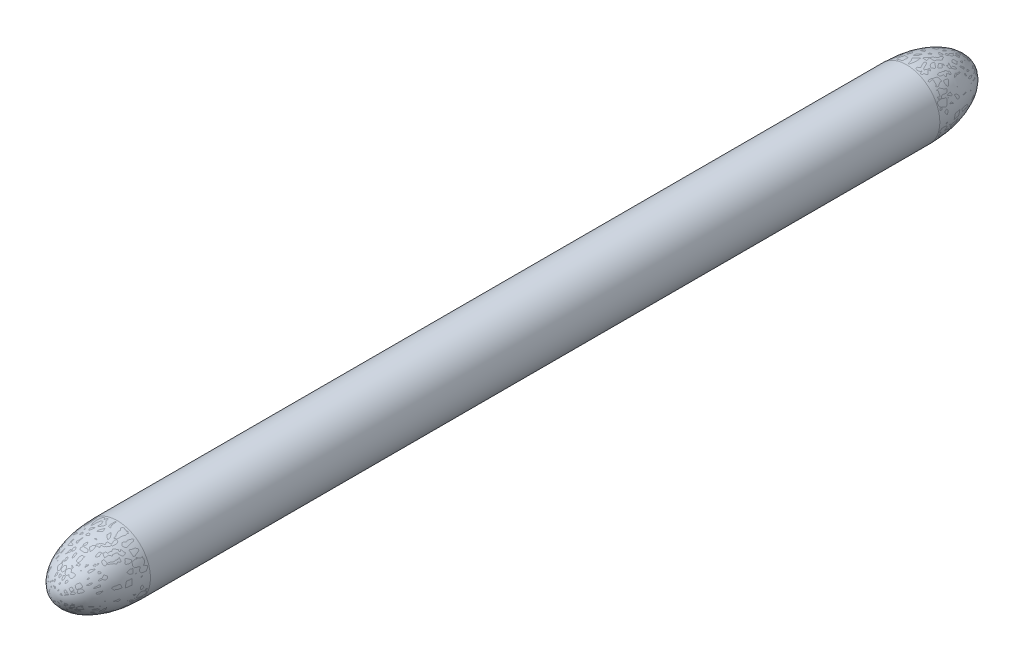
ISO-10303-21;
HEADER;
FILE_DESCRIPTION(('STEP AP214'),'2;1');
FILE_NAME('part.step','',(''),(''),'','','');
FILE_SCHEMA(('AUTOMOTIVE_DESIGN { 1 0 10303 214 1 1 1 1 }'));
ENDSEC;
DATA;
#1=APPLICATION_CONTEXT('core data for automotive mechanical design processes');
#2=APPLICATION_PROTOCOL_DEFINITION('international standard','automotive_design',2000,#1);
#3=PRODUCT_CONTEXT('',#1,'mechanical');
#4=PRODUCT('Part','Part','',(#3));
#5=PRODUCT_RELATED_PRODUCT_CATEGORY('part','',(#4));
#6=PRODUCT_DEFINITION_FORMATION('','',#4);
#7=PRODUCT_DEFINITION_CONTEXT('part definition',#1,'design');
#8=PRODUCT_DEFINITION('design','',#6,#7);
#9=PRODUCT_DEFINITION_SHAPE('','',#8);
#10=(LENGTH_UNIT() NAMED_UNIT(*) SI_UNIT(.MILLI.,.METRE.));
#11=(NAMED_UNIT(*) PLANE_ANGLE_UNIT() SI_UNIT($,.RADIAN.));
#12=(NAMED_UNIT(*) SI_UNIT($,.STERADIAN.) SOLID_ANGLE_UNIT());
#13=UNCERTAINTY_MEASURE_WITH_UNIT(LENGTH_MEASURE(1.E-05),#10,'distance_accuracy_value','');
#14=(GEOMETRIC_REPRESENTATION_CONTEXT(3) GLOBAL_UNCERTAINTY_ASSIGNED_CONTEXT((#13)) GLOBAL_UNIT_ASSIGNED_CONTEXT((#10,
#11,#12)) REPRESENTATION_CONTEXT('',''));
#15=CARTESIAN_POINT('',(0.,0.,0.));
#16=DIRECTION('',(0.,0.,1.));
#17=DIRECTION('',(1.,0.,0.));
#18=AXIS2_PLACEMENT_3D('',#15,#16,#17);
#19=CARTESIAN_POINT('',(0.,0.,25000.));
#20=DIRECTION('',(0.,0.,-1.));
#21=DIRECTION('',(-1.,0.,0.));
#22=AXIS2_PLACEMENT_3D('',#19,#20,#21);
#23=CYLINDRICAL_SURFACE('',#22,1050.);
#24=CARTESIAN_POINT('',(0.,0.,25000.));
#25=DIRECTION('',(0.,0.,1.));
#26=DIRECTION('',(1.,0.,0.));
#27=AXIS2_PLACEMENT_3D('',#24,#25,#26);
#28=CIRCLE('',#27,1050.);
#29=CARTESIAN_POINT('',(1050.,0.,25000.));
#30=VERTEX_POINT('',#29);
#31=EDGE_CURVE('E65',#30,#30,#28,.T.);
#32=ORIENTED_EDGE('',*,*,#31,.F.);
#33=EDGE_LOOP('',(#32));
#34=FACE_BOUND('',#33,.T.);
#35=CARTESIAN_POINT('',(0.,0.,0.));
#36=DIRECTION('',(0.,0.,1.));
#37=DIRECTION('',(1.,0.,0.));
#38=AXIS2_PLACEMENT_3D('',#35,#36,#37);
#39=CIRCLE('',#38,1050.);
#40=CARTESIAN_POINT('',(1050.,0.,0.));
#41=VERTEX_POINT('',#40);
#42=EDGE_CURVE('E67',#41,#41,#39,.T.);
#43=ORIENTED_EDGE('',*,*,#42,.T.);
#44=EDGE_LOOP('',(#43));
#45=FACE_BOUND('',#44,.T.);
#46=ADVANCED_FACE('F36',(#34,#45),#23,.T.);
#47=CARTESIAN_POINT('',(0.,0.,25000.));
#48=DIRECTION('',(0.,1.,0.));
#49=DIRECTION('',(0.,0.,1.));
#50=AXIS2_PLACEMENT_3D('',#47,#48,#49);
#51=ELLIPSE('',#50,2000.,1050.);
#52=TRIMMED_CURVE('',#51,(PARAMETER_VALUE(0.)),(PARAMETER_VALUE(3.14159265358979)),.T.,.PARAMETER.);
#53=CARTESIAN_POINT('',(0.,0.,23000.));
#54=DIRECTION('',(0.,0.,1.));
#55=AXIS1_PLACEMENT('',#53,#54);
#56=SURFACE_OF_REVOLUTION('',#52,#55);
#57=CARTESIAN_POINT('',(0.,0.,27000.));
#58=VERTEX_POINT('',#57);
#59=VERTEX_LOOP('',#58);
#60=FACE_BOUND('',#59,.T.);
#61=ORIENTED_EDGE('',*,*,#31,.T.);
#62=EDGE_LOOP('',(#61));
#63=FACE_BOUND('',#62,.T.);
#64=ADVANCED_FACE('F58',(#60,#63),#56,.F.);
#65=CARTESIAN_POINT('',(0.,0.,0.));
#66=DIRECTION('',(0.,-1.,0.));
#67=DIRECTION('',(0.,0.,-1.));
#68=AXIS2_PLACEMENT_3D('',#65,#66,#67);
#69=ELLIPSE('',#68,2000.,1050.);
#70=TRIMMED_CURVE('',#69,(PARAMETER_VALUE(0.)),(PARAMETER_VALUE(3.14159265358979)),.T.,.PARAMETER.);
#71=CARTESIAN_POINT('',(0.,0.,2000.));
#72=DIRECTION('',(0.,0.,-1.));
#73=AXIS1_PLACEMENT('',#71,#72);
#74=SURFACE_OF_REVOLUTION('',#70,#73);
#75=CARTESIAN_POINT('',(0.,0.,-2000.));
#76=VERTEX_POINT('',#75);
#77=VERTEX_LOOP('',#76);
#78=FACE_BOUND('',#77,.T.);
#79=ORIENTED_EDGE('',*,*,#42,.F.);
#80=EDGE_LOOP('',(#79));
#81=FACE_BOUND('',#80,.T.);
#82=ADVANCED_FACE('F61',(#78,#81),#74,.F.);
#83=CLOSED_SHELL('',(#46,#64,#82));
#84=CARTESIAN_POINT('',(0.,0.,25000.));
#85=DIRECTION('',(0.,0.,-1.));
#86=DIRECTION('',(-1.,0.,0.));
#87=AXIS2_PLACEMENT_3D('',#84,#85,#86);
#88=CYLINDRICAL_SURFACE('',#87,1047.);
#89=CARTESIAN_POINT('',(0.,0.,25000.));
#90=DIRECTION('',(0.,0.,1.));
#91=DIRECTION('',(1.,0.,0.));
#92=AXIS2_PLACEMENT_3D('',#89,#90,#91);
#93=CIRCLE('',#92,1047.);
#94=CARTESIAN_POINT('',(1047.,0.,25000.));
#95=VERTEX_POINT('',#94);
#96=EDGE_CURVE('E11',#95,#95,#93,.T.);
#97=ORIENTED_EDGE('',*,*,#96,.T.);
#98=EDGE_LOOP('',(#97));
#99=FACE_BOUND('',#98,.T.);
#100=CARTESIAN_POINT('',(0.,0.,0.));
#101=DIRECTION('',(0.,0.,-1.));
#102=DIRECTION('',(-1.,0.,0.));
#103=AXIS2_PLACEMENT_3D('',#100,#101,#102);
#104=CIRCLE('',#103,1047.);
#105=CARTESIAN_POINT('',(-1047.,0.,0.));
#106=VERTEX_POINT('',#105);
#107=EDGE_CURVE('E41',#106,#106,#104,.F.);
#108=ORIENTED_EDGE('',*,*,#107,.F.);
#109=EDGE_LOOP('',(#108));
#110=FACE_BOUND('',#109,.T.);
#111=ADVANCED_FACE('F80',(#99,#110),#88,.F.);
#112=CARTESIAN_POINT('',(0.,0.,25000.));
#113=DIRECTION('',(0.,1.,0.));
#114=DIRECTION('',(0.,0.,1.));
#115=AXIS2_PLACEMENT_3D('',#112,#113,#114);
#116=ELLIPSE('',#115,2000.,1050.);
#117=TRIMMED_CURVE('',#116,(PARAMETER_VALUE(0.)),(PARAMETER_VALUE(3.14159265358979)),.T.,.PARAMETER.);
#118=CARTESIAN_POINT('',(0.,0.,23000.));
#119=DIRECTION('',(0.,0.,1.));
#120=AXIS1_PLACEMENT('',#118,#119);
#121=SURFACE_OF_REVOLUTION('',#117,#120);
#122=OFFSET_SURFACE('',#121,3.,.F.);
#123=CARTESIAN_POINT('',(0.,0.,26997.));
#124=VERTEX_POINT('',#123);
#125=VERTEX_LOOP('',#124);
#126=FACE_BOUND('',#125,.T.);
#127=ORIENTED_EDGE('',*,*,#96,.F.);
#128=EDGE_LOOP('',(#127));
#129=FACE_BOUND('',#128,.T.);
#130=ADVANCED_FACE('F88',(#126,#129),#122,.T.);
#131=CARTESIAN_POINT('',(0.,0.,0.));
#132=DIRECTION('',(0.,-1.,0.));
#133=DIRECTION('',(0.,0.,-1.));
#134=AXIS2_PLACEMENT_3D('',#131,#132,#133);
#135=ELLIPSE('',#134,2000.,1050.);
#136=TRIMMED_CURVE('',#135,(PARAMETER_VALUE(0.)),(PARAMETER_VALUE(3.14159265358979)),.T.,.PARAMETER.);
#137=CARTESIAN_POINT('',(0.,0.,2000.));
#138=DIRECTION('',(0.,0.,-1.));
#139=AXIS1_PLACEMENT('',#137,#138);
#140=SURFACE_OF_REVOLUTION('',#136,#139);
#141=OFFSET_SURFACE('',#140,3.,.F.);
#142=CARTESIAN_POINT('',(0.,0.,-1997.));
#143=VERTEX_POINT('',#142);
#144=VERTEX_LOOP('',#143);
#145=FACE_BOUND('',#144,.T.);
#146=ORIENTED_EDGE('',*,*,#107,.T.);
#147=EDGE_LOOP('',(#146));
#148=FACE_BOUND('',#147,.T.);
#149=ADVANCED_FACE('F89',(#145,#148),#141,.T.);
#150=CLOSED_SHELL('',(#111,#130,#149));
#151=ORIENTED_CLOSED_SHELL('',*,#150,.T.);
#152=BREP_WITH_VOIDS('B2',#83,(#151));
#153=ADVANCED_BREP_SHAPE_REPRESENTATION('',(#18,#152),#14);
#154=SHAPE_DEFINITION_REPRESENTATION(#9,#153);
ENDSEC;
END-ISO-10303-21;
